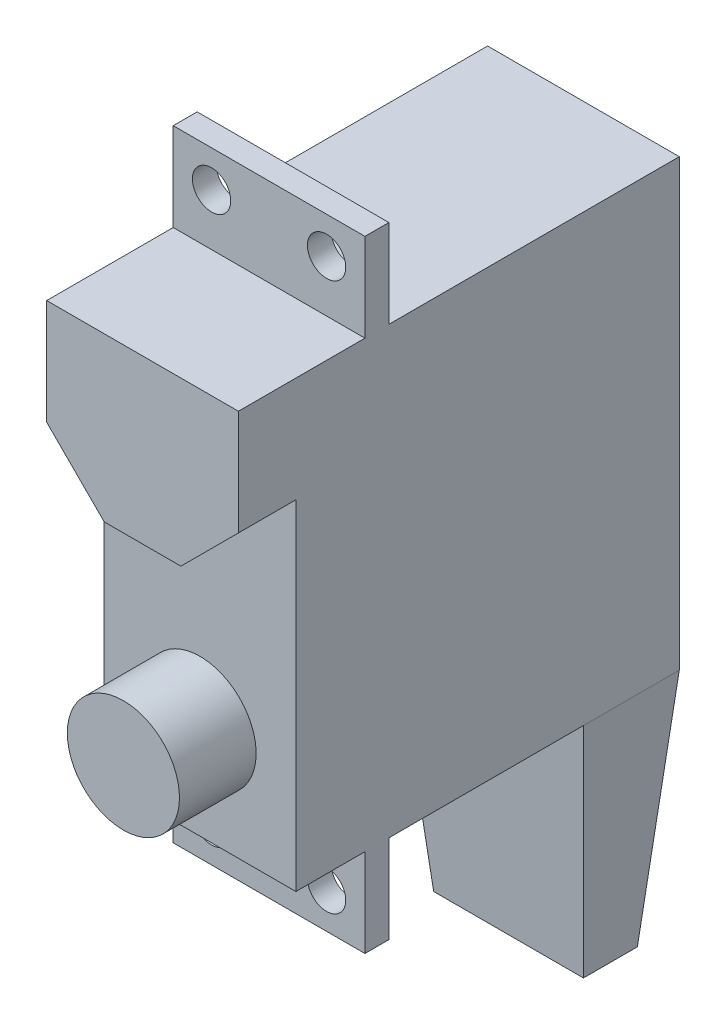
ISO-10303-21;
HEADER;
FILE_DESCRIPTION(('STEP AP214'),'2;1');
FILE_NAME('part.step','',(''),(''),'','','');
FILE_SCHEMA(('AUTOMOTIVE_DESIGN { 1 0 10303 214 1 1 1 1 }'));
ENDSEC;
DATA;
#1=APPLICATION_CONTEXT('core data for automotive mechanical design processes');
#2=APPLICATION_PROTOCOL_DEFINITION('international standard','automotive_design',2000,#1);
#3=PRODUCT_CONTEXT('',#1,'mechanical');
#4=PRODUCT('Part','Part','',(#3));
#5=PRODUCT_RELATED_PRODUCT_CATEGORY('part','',(#4));
#6=PRODUCT_DEFINITION_FORMATION('','',#4);
#7=PRODUCT_DEFINITION_CONTEXT('part definition',#1,'design');
#8=PRODUCT_DEFINITION('design','',#6,#7);
#9=PRODUCT_DEFINITION_SHAPE('','',#8);
#10=(LENGTH_UNIT() NAMED_UNIT(*) SI_UNIT(.MILLI.,.METRE.));
#11=(NAMED_UNIT(*) PLANE_ANGLE_UNIT() SI_UNIT($,.RADIAN.));
#12=(NAMED_UNIT(*) SI_UNIT($,.STERADIAN.) SOLID_ANGLE_UNIT());
#13=UNCERTAINTY_MEASURE_WITH_UNIT(LENGTH_MEASURE(1.E-05),#10,'distance_accuracy_value','');
#14=(GEOMETRIC_REPRESENTATION_CONTEXT(3) GLOBAL_UNCERTAINTY_ASSIGNED_CONTEXT((#13)) GLOBAL_UNIT_ASSIGNED_CONTEXT((#10,
#11,#12)) REPRESENTATION_CONTEXT('',''));
#15=CARTESIAN_POINT('',(0.,0.,0.));
#16=DIRECTION('',(0.,0.,1.));
#17=DIRECTION('',(1.,0.,0.));
#18=AXIS2_PLACEMENT_3D('',#15,#16,#17);
#19=CARTESIAN_POINT('',(0.,0.,20.));
#20=DIRECTION('',(0.,1.,0.));
#21=DIRECTION('',(0.,0.,1.));
#22=AXIS2_PLACEMENT_3D('',#19,#20,#21);
#23=PLANE('',#22);
#24=DIRECTION('',(-1.,0.,0.));
#25=VECTOR('',#24,1.);
#26=CARTESIAN_POINT('',(0.,0.,5.));
#27=LINE('',#26,#25);
#28=CARTESIAN_POINT('',(0.,0.,5.));
#29=VERTEX_POINT('',#28);
#30=CARTESIAN_POINT('',(-10.,0.,5.));
#31=VERTEX_POINT('',#30);
#32=EDGE_CURVE('E62',#29,#31,#27,.T.);
#33=ORIENTED_EDGE('',*,*,#32,.F.);
#34=DIRECTION('',(0.,0.,-1.));
#35=VECTOR('',#34,1.);
#36=CARTESIAN_POINT('',(0.,0.,20.));
#37=LINE('',#36,#35);
#38=CARTESIAN_POINT('',(0.,0.,15.15));
#39=VERTEX_POINT('',#38);
#40=EDGE_CURVE('E197',#39,#29,#37,.T.);
#41=ORIENTED_EDGE('',*,*,#40,.F.);
#42=DIRECTION('',(1.,0.,0.));
#43=VECTOR('',#42,1.);
#44=CARTESIAN_POINT('',(0.,0.,15.15));
#45=LINE('',#44,#43);
#46=CARTESIAN_POINT('',(-10.,0.,15.15));
#47=VERTEX_POINT('',#46);
#48=EDGE_CURVE('E300',#47,#39,#45,.T.);
#49=ORIENTED_EDGE('',*,*,#48,.F.);
#50=DIRECTION('',(0.,0.,-1.));
#51=VECTOR('',#50,1.);
#52=CARTESIAN_POINT('',(-10.,0.,20.));
#53=LINE('',#52,#51);
#54=EDGE_CURVE('E325',#47,#31,#53,.T.);
#55=ORIENTED_EDGE('',*,*,#54,.T.);
#56=EDGE_LOOP('',(#33,#41,#49,#55));
#57=FACE_BOUND('',#56,.T.);
#58=ADVANCED_FACE('F46',(#57),#23,.F.);
#59=CARTESIAN_POINT('',(0.,23.2,20.));
#60=DIRECTION('',(0.,-1.,0.));
#61=DIRECTION('',(0.,0.,-1.));
#62=AXIS2_PLACEMENT_3D('',#59,#60,#61);
#63=PLANE('',#62);
#64=DIRECTION('',(-1.,0.,0.));
#65=VECTOR('',#64,1.);
#66=CARTESIAN_POINT('',(0.,23.2,15.15));
#67=LINE('',#66,#65);
#68=CARTESIAN_POINT('',(0.,23.2,15.15));
#69=VERTEX_POINT('',#68);
#70=CARTESIAN_POINT('',(-10.,23.2,15.15));
#71=VERTEX_POINT('',#70);
#72=EDGE_CURVE('E298',#69,#71,#67,.T.);
#73=ORIENTED_EDGE('',*,*,#72,.F.);
#74=DIRECTION('',(0.,0.,-1.));
#75=VECTOR('',#74,1.);
#76=CARTESIAN_POINT('',(0.,23.2,20.));
#77=LINE('',#76,#75);
#78=CARTESIAN_POINT('',(0.,23.2,0.));
#79=VERTEX_POINT('',#78);
#80=EDGE_CURVE('E336',#69,#79,#77,.T.);
#81=ORIENTED_EDGE('',*,*,#80,.T.);
#82=DIRECTION('',(-1.,0.,0.));
#83=VECTOR('',#82,1.);
#84=CARTESIAN_POINT('',(0.,23.2,0.));
#85=LINE('',#84,#83);
#86=CARTESIAN_POINT('',(-10.,23.2,0.));
#87=VERTEX_POINT('',#86);
#88=EDGE_CURVE('E188',#79,#87,#85,.T.);
#89=ORIENTED_EDGE('',*,*,#88,.T.);
#90=DIRECTION('',(0.,0.,-1.));
#91=VECTOR('',#90,1.);
#92=CARTESIAN_POINT('',(-10.,23.2,20.));
#93=LINE('',#92,#91);
#94=EDGE_CURVE('E332',#71,#87,#93,.T.);
#95=ORIENTED_EDGE('',*,*,#94,.F.);
#96=EDGE_LOOP('',(#73,#81,#89,#95));
#97=FACE_BOUND('',#96,.T.);
#98=ADVANCED_FACE('F420',(#97),#63,.F.);
#99=CARTESIAN_POINT('',(0.,0.,20.));
#100=DIRECTION('',(0.,0.,-1.));
#101=DIRECTION('',(-1.,0.,0.));
#102=AXIS2_PLACEMENT_3D('',#99,#100,#101);
#103=PLANE('',#102);
#104=CARTESIAN_POINT('',(-5.,5.2,20.));
#105=DIRECTION('',(0.,0.,-1.));
#106=DIRECTION('',(-1.,0.,0.));
#107=AXIS2_PLACEMENT_3D('',#104,#105,#106);
#108=CIRCLE('',#107,2.925);
#109=CARTESIAN_POINT('',(-7.925,5.2,20.));
#110=VERTEX_POINT('',#109);
#111=EDGE_CURVE('E11',#110,#110,#108,.F.);
#112=ORIENTED_EDGE('',*,*,#111,.F.);
#113=EDGE_LOOP('',(#112));
#114=FACE_BOUND('',#113,.T.);
#115=DIRECTION('',(1.,0.,0.));
#116=VECTOR('',#115,1.);
#117=CARTESIAN_POINT('',(-10.,14.7,20.));
#118=LINE('',#117,#116);
#119=CARTESIAN_POINT('',(-7.,14.7,20.));
#120=VERTEX_POINT('',#119);
#121=CARTESIAN_POINT('',(-3.00000000000001,14.7,20.));
#122=VERTEX_POINT('',#121);
#123=EDGE_CURVE('E305',#120,#122,#118,.T.);
#124=ORIENTED_EDGE('',*,*,#123,.F.);
#125=DIRECTION('',(0.707106781186546,-0.707106781186549,0.));
#126=VECTOR('',#125,1.);
#127=CARTESIAN_POINT('',(3.84999999999999,3.84999999999998,20.));
#128=LINE('',#127,#126);
#129=CARTESIAN_POINT('',(-10.,17.7,20.));
#130=VERTEX_POINT('',#129);
#131=EDGE_CURVE('E356',#120,#130,#128,.F.);
#132=ORIENTED_EDGE('',*,*,#131,.T.);
#133=DIRECTION('',(0.,-1.,0.));
#134=VECTOR('',#133,1.);
#135=CARTESIAN_POINT('',(-10.,0.,20.));
#136=LINE('',#135,#134);
#137=CARTESIAN_POINT('',(-10.,0.,20.));
#138=VERTEX_POINT('',#137);
#139=EDGE_CURVE('E324',#130,#138,#136,.T.);
#140=ORIENTED_EDGE('',*,*,#139,.T.);
#141=DIRECTION('',(1.,0.,0.));
#142=VECTOR('',#141,1.);
#143=CARTESIAN_POINT('',(0.,0.,20.));
#144=LINE('',#143,#142);
#145=CARTESIAN_POINT('',(0.,0.,20.));
#146=VERTEX_POINT('',#145);
#147=EDGE_CURVE('E318',#138,#146,#144,.T.);
#148=ORIENTED_EDGE('',*,*,#147,.T.);
#149=DIRECTION('',(0.,1.,0.));
#150=VECTOR('',#149,1.);
#151=CARTESIAN_POINT('',(0.,0.,20.));
#152=LINE('',#151,#150);
#153=CARTESIAN_POINT('',(0.,17.7,20.));
#154=VERTEX_POINT('',#153);
#155=EDGE_CURVE('E321',#146,#154,#152,.T.);
#156=ORIENTED_EDGE('',*,*,#155,.T.);
#157=DIRECTION('',(0.707106781186548,0.707106781186547,0.));
#158=VECTOR('',#157,1.);
#159=CARTESIAN_POINT('',(-8.85,8.85000000000002,20.));
#160=LINE('',#159,#158);
#161=EDGE_CURVE('E55',#154,#122,#160,.F.);
#162=ORIENTED_EDGE('',*,*,#161,.T.);
#163=EDGE_LOOP('',(#124,#132,#140,#148,#156,#162));
#164=FACE_BOUND('',#163,.T.);
#165=ADVANCED_FACE('F361',(#114,#164),#103,.F.);
#166=CARTESIAN_POINT('',(-10.,0.,16.4));
#167=VERTEX_POINT('',#166);
#168=EDGE_CURVE('E329',#138,#167,#53,.T.);
#169=ORIENTED_EDGE('',*,*,#168,.T.);
#170=DIRECTION('',(1.,0.,0.));
#171=VECTOR('',#170,1.);
#172=CARTESIAN_POINT('',(0.,0.,16.4));
#173=LINE('',#172,#171);
#174=CARTESIAN_POINT('',(0.,0.,16.4));
#175=VERTEX_POINT('',#174);
#176=EDGE_CURVE('E295',#167,#175,#173,.T.);
#177=ORIENTED_EDGE('',*,*,#176,.T.);
#178=EDGE_CURVE('E340',#146,#175,#37,.T.);
#179=ORIENTED_EDGE('',*,*,#178,.F.);
#180=ORIENTED_EDGE('',*,*,#147,.F.);
#181=EDGE_LOOP('',(#169,#177,#179,#180));
#182=FACE_BOUND('',#181,.T.);
#183=ADVANCED_FACE('F390',(#182),#23,.F.);
#184=CARTESIAN_POINT('',(0.,0.,20.));
#185=DIRECTION('',(-1.,0.,0.));
#186=DIRECTION('',(0.,0.,1.));
#187=AXIS2_PLACEMENT_3D('',#184,#185,#186);
#188=PLANE('',#187);
#189=ORIENTED_EDGE('',*,*,#178,.T.);
#190=DIRECTION('',(0.,1.,0.));
#191=VECTOR('',#190,1.);
#192=CARTESIAN_POINT('',(0.,27.8,16.4));
#193=LINE('',#192,#191);
#194=CARTESIAN_POINT('',(0.,-4.6,16.4));
#195=VERTEX_POINT('',#194);
#196=EDGE_CURVE('E278',#195,#175,#193,.T.);
#197=ORIENTED_EDGE('',*,*,#196,.F.);
#198=DIRECTION('',(0.,0.,1.));
#199=VECTOR('',#198,1.);
#200=CARTESIAN_POINT('',(0.,-4.6,15.15));
#201=LINE('',#200,#199);
#202=CARTESIAN_POINT('',(0.,-4.6,15.15));
#203=VERTEX_POINT('',#202);
#204=EDGE_CURVE('E289',#203,#195,#201,.T.);
#205=ORIENTED_EDGE('',*,*,#204,.F.);
#206=DIRECTION('',(0.,1.,0.));
#207=VECTOR('',#206,1.);
#208=CARTESIAN_POINT('',(0.,27.8,15.15));
#209=LINE('',#208,#207);
#210=EDGE_CURVE('E266',#203,#39,#209,.T.);
#211=ORIENTED_EDGE('',*,*,#210,.T.);
#212=ORIENTED_EDGE('',*,*,#40,.T.);
#213=DIRECTION('',(0.,0.,1.));
#214=VECTOR('',#213,1.);
#215=CARTESIAN_POINT('',(0.,0.,0.));
#216=LINE('',#215,#214);
#217=CARTESIAN_POINT('',(0.,0.,0.));
#218=VERTEX_POINT('',#217);
#219=EDGE_CURVE('E193',#218,#29,#216,.T.);
#220=ORIENTED_EDGE('',*,*,#219,.F.);
#221=DIRECTION('',(0.,1.,0.));
#222=VECTOR('',#221,1.);
#223=CARTESIAN_POINT('',(0.,0.,0.));
#224=LINE('',#223,#222);
#225=EDGE_CURVE('E181',#218,#79,#224,.T.);
#226=ORIENTED_EDGE('',*,*,#225,.T.);
#227=ORIENTED_EDGE('',*,*,#80,.F.);
#228=CARTESIAN_POINT('',(0.,27.8,15.15));
#229=VERTEX_POINT('',#228);
#230=EDGE_CURVE('E265',#69,#229,#209,.T.);
#231=ORIENTED_EDGE('',*,*,#230,.T.);
#232=DIRECTION('',(0.,0.,1.));
#233=VECTOR('',#232,1.);
#234=CARTESIAN_POINT('',(0.,27.8,15.15));
#235=LINE('',#234,#233);
#236=CARTESIAN_POINT('',(0.,27.8,16.4));
#237=VERTEX_POINT('',#236);
#238=EDGE_CURVE('E286',#229,#237,#235,.T.);
#239=ORIENTED_EDGE('',*,*,#238,.T.);
#240=CARTESIAN_POINT('',(0.,23.2,16.4));
#241=VERTEX_POINT('',#240);
#242=EDGE_CURVE('E277',#241,#237,#193,.T.);
#243=ORIENTED_EDGE('',*,*,#242,.F.);
#244=CARTESIAN_POINT('',(0.,23.2,23.));
#245=VERTEX_POINT('',#244);
#246=EDGE_CURVE('E337',#245,#241,#77,.T.);
#247=ORIENTED_EDGE('',*,*,#246,.F.);
#248=DIRECTION('',(0.,1.,0.));
#249=VECTOR('',#248,1.);
#250=CARTESIAN_POINT('',(0.,23.2,23.));
#251=LINE('',#250,#249);
#252=CARTESIAN_POINT('',(0.,17.7,23.));
#253=VERTEX_POINT('',#252);
#254=EDGE_CURVE('E312',#253,#245,#251,.T.);
#255=ORIENTED_EDGE('',*,*,#254,.F.);
#256=DIRECTION('',(0.,0.,-1.));
#257=VECTOR('',#256,1.);
#258=CARTESIAN_POINT('',(0.,17.7,20.));
#259=LINE('',#258,#257);
#260=EDGE_CURVE('E353',#253,#154,#259,.T.);
#261=ORIENTED_EDGE('',*,*,#260,.T.);
#262=ORIENTED_EDGE('',*,*,#155,.F.);
#263=EDGE_LOOP('',(#189,#197,#205,#211,#212,#220,#226,#227,#231,#239,#243,#247,#255,#261,#262));
#264=FACE_BOUND('',#263,.T.);
#265=ADVANCED_FACE('F195',(#264),#188,.F.);
#266=ORIENTED_EDGE('',*,*,#246,.T.);
#267=DIRECTION('',(-1.,0.,0.));
#268=VECTOR('',#267,1.);
#269=CARTESIAN_POINT('',(0.,23.2,16.4));
#270=LINE('',#269,#268);
#271=CARTESIAN_POINT('',(-10.,23.2,16.4));
#272=VERTEX_POINT('',#271);
#273=EDGE_CURVE('E285',#241,#272,#270,.T.);
#274=ORIENTED_EDGE('',*,*,#273,.T.);
#275=CARTESIAN_POINT('',(-10.,23.2,23.));
#276=VERTEX_POINT('',#275);
#277=EDGE_CURVE('E333',#276,#272,#93,.T.);
#278=ORIENTED_EDGE('',*,*,#277,.F.);
#279=DIRECTION('',(-1.,0.,0.));
#280=VECTOR('',#279,1.);
#281=CARTESIAN_POINT('',(-10.,23.2,23.));
#282=LINE('',#281,#280);
#283=EDGE_CURVE('E212',#245,#276,#282,.T.);
#284=ORIENTED_EDGE('',*,*,#283,.F.);
#285=EDGE_LOOP('',(#266,#274,#278,#284));
#286=FACE_BOUND('',#285,.T.);
#287=ADVANCED_FACE('F377',(#286),#63,.F.);
#288=CARTESIAN_POINT('',(-10.,0.,20.));
#289=DIRECTION('',(1.,0.,0.));
#290=DIRECTION('',(0.,0.,-1.));
#291=AXIS2_PLACEMENT_3D('',#288,#289,#290);
#292=PLANE('',#291);
#293=ORIENTED_EDGE('',*,*,#277,.T.);
#294=DIRECTION('',(0.,-1.,0.));
#295=VECTOR('',#294,1.);
#296=CARTESIAN_POINT('',(-10.,27.8,16.4));
#297=LINE('',#296,#295);
#298=CARTESIAN_POINT('',(-10.,27.8,16.4));
#299=VERTEX_POINT('',#298);
#300=EDGE_CURVE('E272',#299,#272,#297,.T.);
#301=ORIENTED_EDGE('',*,*,#300,.F.);
#302=DIRECTION('',(0.,0.,1.));
#303=VECTOR('',#302,1.);
#304=CARTESIAN_POINT('',(-10.,27.8,15.15));
#305=LINE('',#304,#303);
#306=CARTESIAN_POINT('',(-10.,27.8,15.15));
#307=VERTEX_POINT('',#306);
#308=EDGE_CURVE('E283',#307,#299,#305,.T.);
#309=ORIENTED_EDGE('',*,*,#308,.F.);
#310=DIRECTION('',(0.,-1.,0.));
#311=VECTOR('',#310,1.);
#312=CARTESIAN_POINT('',(-10.,27.8,15.15));
#313=LINE('',#312,#311);
#314=EDGE_CURVE('E258',#307,#71,#313,.T.);
#315=ORIENTED_EDGE('',*,*,#314,.T.);
#316=ORIENTED_EDGE('',*,*,#94,.T.);
#317=DIRECTION('',(0.,-1.,0.));
#318=VECTOR('',#317,1.);
#319=CARTESIAN_POINT('',(-10.,0.,0.));
#320=LINE('',#319,#318);
#321=CARTESIAN_POINT('',(-10.,0.,0.));
#322=VERTEX_POINT('',#321);
#323=EDGE_CURVE('E322',#87,#322,#320,.T.);
#324=ORIENTED_EDGE('',*,*,#323,.T.);
#325=DIRECTION('',(0.,0.,-1.));
#326=VECTOR('',#325,1.);
#327=CARTESIAN_POINT('',(-10.,0.,0.));
#328=LINE('',#327,#326);
#329=EDGE_CURVE('E70',#31,#322,#328,.T.);
#330=ORIENTED_EDGE('',*,*,#329,.F.);
#331=ORIENTED_EDGE('',*,*,#54,.F.);
#332=CARTESIAN_POINT('',(-10.,-4.6,15.15));
#333=VERTEX_POINT('',#332);
#334=EDGE_CURVE('E262',#47,#333,#313,.T.);
#335=ORIENTED_EDGE('',*,*,#334,.T.);
#336=DIRECTION('',(0.,0.,1.));
#337=VECTOR('',#336,1.);
#338=CARTESIAN_POINT('',(-10.,-4.6,15.15));
#339=LINE('',#338,#337);
#340=CARTESIAN_POINT('',(-10.,-4.6,16.4));
#341=VERTEX_POINT('',#340);
#342=EDGE_CURVE('E271',#333,#341,#339,.T.);
#343=ORIENTED_EDGE('',*,*,#342,.T.);
#344=EDGE_CURVE('E255',#167,#341,#297,.T.);
#345=ORIENTED_EDGE('',*,*,#344,.F.);
#346=ORIENTED_EDGE('',*,*,#168,.F.);
#347=ORIENTED_EDGE('',*,*,#139,.F.);
#348=DIRECTION('',(0.,0.,1.));
#349=VECTOR('',#348,1.);
#350=CARTESIAN_POINT('',(-10.,17.7,20.));
#351=LINE('',#350,#349);
#352=CARTESIAN_POINT('',(-10.,17.7,23.));
#353=VERTEX_POINT('',#352);
#354=EDGE_CURVE('E347',#130,#353,#351,.T.);
#355=ORIENTED_EDGE('',*,*,#354,.T.);
#356=DIRECTION('',(0.,-1.,0.));
#357=VECTOR('',#356,1.);
#358=CARTESIAN_POINT('',(-10.,23.2,23.));
#359=LINE('',#358,#357);
#360=EDGE_CURVE('E306',#276,#353,#359,.T.);
#361=ORIENTED_EDGE('',*,*,#360,.F.);
#362=EDGE_LOOP('',(#293,#301,#309,#315,#316,#324,#330,#331,#335,#343,#345,#346,#347,#355,#361));
#363=FACE_BOUND('',#362,.T.);
#364=ADVANCED_FACE('F380',(#363),#292,.F.);
#365=CARTESIAN_POINT('',(0.,0.,0.));
#366=DIRECTION('',(0.,0.,-1.));
#367=DIRECTION('',(-1.,0.,0.));
#368=AXIS2_PLACEMENT_3D('',#365,#366,#367);
#369=PLANE('',#368);
#370=DIRECTION('',(1.,0.,0.));
#371=VECTOR('',#370,1.);
#372=CARTESIAN_POINT('',(0.,0.,0.));
#373=LINE('',#372,#371);
#374=EDGE_CURVE('E186',#322,#218,#373,.T.);
#375=ORIENTED_EDGE('',*,*,#374,.F.);
#376=ORIENTED_EDGE('',*,*,#323,.F.);
#377=ORIENTED_EDGE('',*,*,#88,.F.);
#378=ORIENTED_EDGE('',*,*,#225,.F.);
#379=EDGE_LOOP('',(#375,#376,#377,#378));
#380=FACE_BOUND('',#379,.T.);
#381=ADVANCED_FACE('F183',(#380),#369,.T.);
#382=CARTESIAN_POINT('',(-10.,14.7,23.));
#383=DIRECTION('',(0.,1.,0.));
#384=DIRECTION('',(0.,0.,1.));
#385=AXIS2_PLACEMENT_3D('',#382,#383,#384);
#386=PLANE('',#385);
#387=DIRECTION('',(1.,0.,0.));
#388=VECTOR('',#387,1.);
#389=CARTESIAN_POINT('',(-10.,14.7,23.));
#390=LINE('',#389,#388);
#391=CARTESIAN_POINT('',(-7.,14.7,23.));
#392=VERTEX_POINT('',#391);
#393=CARTESIAN_POINT('',(-3.00000000000001,14.7,23.));
#394=VERTEX_POINT('',#393);
#395=EDGE_CURVE('E309',#392,#394,#390,.T.);
#396=ORIENTED_EDGE('',*,*,#395,.F.);
#397=DIRECTION('',(0.,0.,-1.));
#398=VECTOR('',#397,1.);
#399=CARTESIAN_POINT('',(-7.,14.7,23.));
#400=LINE('',#399,#398);
#401=EDGE_CURVE('E344',#392,#120,#400,.T.);
#402=ORIENTED_EDGE('',*,*,#401,.T.);
#403=ORIENTED_EDGE('',*,*,#123,.T.);
#404=DIRECTION('',(0.,0.,1.));
#405=VECTOR('',#404,1.);
#406=CARTESIAN_POINT('',(-3.00000000000001,14.7,23.));
#407=LINE('',#406,#405);
#408=EDGE_CURVE('E342',#122,#394,#407,.T.);
#409=ORIENTED_EDGE('',*,*,#408,.T.);
#410=EDGE_LOOP('',(#396,#402,#403,#409));
#411=FACE_BOUND('',#410,.T.);
#412=ADVANCED_FACE('F367',(#411),#386,.F.);
#413=CARTESIAN_POINT('',(0.,0.,23.));
#414=DIRECTION('',(0.,0.,1.));
#415=DIRECTION('',(1.,0.,0.));
#416=AXIS2_PLACEMENT_3D('',#413,#414,#415);
#417=PLANE('',#416);
#418=ORIENTED_EDGE('',*,*,#360,.T.);
#419=DIRECTION('',(-0.707106781186546,0.707106781186549,0.));
#420=VECTOR('',#419,1.);
#421=CARTESIAN_POINT('',(3.84999999999999,3.84999999999998,23.));
#422=LINE('',#421,#420);
#423=EDGE_CURVE('E351',#353,#392,#422,.F.);
#424=ORIENTED_EDGE('',*,*,#423,.T.);
#425=ORIENTED_EDGE('',*,*,#395,.T.);
#426=DIRECTION('',(-0.707106781186548,-0.707106781186547,0.));
#427=VECTOR('',#426,1.);
#428=CARTESIAN_POINT('',(-8.85,8.85000000000002,23.));
#429=LINE('',#428,#427);
#430=EDGE_CURVE('E349',#394,#253,#429,.F.);
#431=ORIENTED_EDGE('',*,*,#430,.T.);
#432=ORIENTED_EDGE('',*,*,#254,.T.);
#433=ORIENTED_EDGE('',*,*,#283,.T.);
#434=EDGE_LOOP('',(#418,#424,#425,#431,#432,#433));
#435=FACE_BOUND('',#434,.T.);
#436=ADVANCED_FACE('F372',(#435),#417,.T.);
#437=CARTESIAN_POINT('',(-7.,14.7,23.));
#438=DIRECTION('',(0.707106781186549,0.707106781186546,0.));
#439=DIRECTION('',(0.,0.,-1.));
#440=AXIS2_PLACEMENT_3D('',#437,#438,#439);
#441=PLANE('',#440);
#442=ORIENTED_EDGE('',*,*,#423,.F.);
#443=ORIENTED_EDGE('',*,*,#354,.F.);
#444=ORIENTED_EDGE('',*,*,#131,.F.);
#445=ORIENTED_EDGE('',*,*,#401,.F.);
#446=EDGE_LOOP('',(#442,#443,#444,#445));
#447=FACE_BOUND('',#446,.T.);
#448=ADVANCED_FACE('F385',(#447),#441,.F.);
#449=CARTESIAN_POINT('',(0.,17.7,20.));
#450=DIRECTION('',(-0.707106781186547,0.707106781186548,0.));
#451=DIRECTION('',(0.,0.,-1.));
#452=AXIS2_PLACEMENT_3D('',#449,#450,#451);
#453=PLANE('',#452);
#454=ORIENTED_EDGE('',*,*,#430,.F.);
#455=ORIENTED_EDGE('',*,*,#408,.F.);
#456=ORIENTED_EDGE('',*,*,#161,.F.);
#457=ORIENTED_EDGE('',*,*,#260,.F.);
#458=EDGE_LOOP('',(#454,#455,#456,#457));
#459=FACE_BOUND('',#458,.T.);
#460=ADVANCED_FACE('F49',(#459),#453,.F.);
#461=CARTESIAN_POINT('',(-5.,5.2,24.));
#462=DIRECTION('',(0.,0.,-1.));
#463=DIRECTION('',(-1.,0.,0.));
#464=AXIS2_PLACEMENT_3D('',#461,#462,#463);
#465=CYLINDRICAL_SURFACE('',#464,2.925);
#466=CARTESIAN_POINT('',(-5.,5.2,24.));
#467=DIRECTION('',(0.,0.,1.));
#468=DIRECTION('',(1.,0.,0.));
#469=AXIS2_PLACEMENT_3D('',#466,#467,#468);
#470=CIRCLE('',#469,2.925);
#471=CARTESIAN_POINT('',(-2.075,5.2,24.));
#472=VERTEX_POINT('',#471);
#473=EDGE_CURVE('E302',#472,#472,#470,.T.);
#474=ORIENTED_EDGE('',*,*,#473,.F.);
#475=EDGE_LOOP('',(#474));
#476=FACE_BOUND('',#475,.T.);
#477=ORIENTED_EDGE('',*,*,#111,.T.);
#478=EDGE_LOOP('',(#477));
#479=FACE_BOUND('',#478,.T.);
#480=ADVANCED_FACE('F581',(#476,#479),#465,.T.);
#481=CARTESIAN_POINT('',(-5.,5.2,24.));
#482=DIRECTION('',(0.,0.,1.));
#483=DIRECTION('',(1.,0.,0.));
#484=AXIS2_PLACEMENT_3D('',#481,#482,#483);
#485=PLANE('',#484);
#486=ORIENTED_EDGE('',*,*,#473,.T.);
#487=EDGE_LOOP('',(#486));
#488=FACE_BOUND('',#487,.T.);
#489=ADVANCED_FACE('F461',(#488),#485,.T.);
#490=CARTESIAN_POINT('',(-10.,27.8,15.15));
#491=DIRECTION('',(0.,1.,0.));
#492=DIRECTION('',(-1.,0.,0.));
#493=AXIS2_PLACEMENT_3D('',#490,#491,#492);
#494=PLANE('',#493);
#495=DIRECTION('',(-1.,0.,0.));
#496=VECTOR('',#495,1.);
#497=CARTESIAN_POINT('',(-10.,27.8,16.4));
#498=LINE('',#497,#496);
#499=EDGE_CURVE('E280',#237,#299,#498,.T.);
#500=ORIENTED_EDGE('',*,*,#499,.F.);
#501=ORIENTED_EDGE('',*,*,#238,.F.);
#502=DIRECTION('',(-1.,0.,0.));
#503=VECTOR('',#502,1.);
#504=CARTESIAN_POINT('',(-10.,27.8,15.15));
#505=LINE('',#504,#503);
#506=EDGE_CURVE('E268',#229,#307,#505,.T.);
#507=ORIENTED_EDGE('',*,*,#506,.T.);
#508=ORIENTED_EDGE('',*,*,#308,.T.);
#509=EDGE_LOOP('',(#500,#501,#507,#508));
#510=FACE_BOUND('',#509,.T.);
#511=ADVANCED_FACE('F456',(#510),#494,.T.);
#512=CARTESIAN_POINT('',(0.,0.,16.4));
#513=DIRECTION('',(0.,0.,1.));
#514=DIRECTION('',(1.,0.,0.));
#515=AXIS2_PLACEMENT_3D('',#512,#513,#514);
#516=PLANE('',#515);
#517=CARTESIAN_POINT('',(-8.,25.9,16.4));
#518=DIRECTION('',(0.,0.,1.));
#519=DIRECTION('',(1.,0.,0.));
#520=AXIS2_PLACEMENT_3D('',#517,#518,#519);
#521=CIRCLE('',#520,1.);
#522=CARTESIAN_POINT('',(-7.,25.9,16.4));
#523=VERTEX_POINT('',#522);
#524=EDGE_CURVE('E246',#523,#523,#521,.T.);
#525=ORIENTED_EDGE('',*,*,#524,.F.);
#526=EDGE_LOOP('',(#525));
#527=FACE_BOUND('',#526,.T.);
#528=CARTESIAN_POINT('',(-2.,25.9,16.4));
#529=DIRECTION('',(0.,0.,1.));
#530=DIRECTION('',(1.,0.,0.));
#531=AXIS2_PLACEMENT_3D('',#528,#529,#530);
#532=CIRCLE('',#531,1.);
#533=CARTESIAN_POINT('',(-0.999999999999996,25.9,16.4));
#534=VERTEX_POINT('',#533);
#535=EDGE_CURVE('E240',#534,#534,#532,.T.);
#536=ORIENTED_EDGE('',*,*,#535,.F.);
#537=EDGE_LOOP('',(#536));
#538=FACE_BOUND('',#537,.T.);
#539=ORIENTED_EDGE('',*,*,#273,.F.);
#540=ORIENTED_EDGE('',*,*,#242,.T.);
#541=ORIENTED_EDGE('',*,*,#499,.T.);
#542=ORIENTED_EDGE('',*,*,#300,.T.);
#543=EDGE_LOOP('',(#539,#540,#541,#542));
#544=FACE_BOUND('',#543,.T.);
#545=ADVANCED_FACE('F460',(#527,#538,#544),#516,.T.);
#546=CARTESIAN_POINT('',(0.,0.,15.15));
#547=DIRECTION('',(0.,0.,1.));
#548=DIRECTION('',(1.,0.,0.));
#549=AXIS2_PLACEMENT_3D('',#546,#547,#548);
#550=PLANE('',#549);
#551=CARTESIAN_POINT('',(-8.,25.9,15.15));
#552=DIRECTION('',(0.,0.,1.));
#553=DIRECTION('',(1.,0.,0.));
#554=AXIS2_PLACEMENT_3D('',#551,#552,#553);
#555=CIRCLE('',#554,1.);
#556=CARTESIAN_POINT('',(-7.,25.9,15.15));
#557=VERTEX_POINT('',#556);
#558=EDGE_CURVE('E249',#557,#557,#555,.T.);
#559=ORIENTED_EDGE('',*,*,#558,.T.);
#560=EDGE_LOOP('',(#559));
#561=FACE_BOUND('',#560,.T.);
#562=CARTESIAN_POINT('',(-2.,25.9,15.15));
#563=DIRECTION('',(0.,0.,1.));
#564=DIRECTION('',(1.,0.,0.));
#565=AXIS2_PLACEMENT_3D('',#562,#563,#564);
#566=CIRCLE('',#565,1.);
#567=CARTESIAN_POINT('',(-0.999999999999996,25.9,15.15));
#568=VERTEX_POINT('',#567);
#569=EDGE_CURVE('E243',#568,#568,#566,.T.);
#570=ORIENTED_EDGE('',*,*,#569,.T.);
#571=EDGE_LOOP('',(#570));
#572=FACE_BOUND('',#571,.T.);
#573=ORIENTED_EDGE('',*,*,#230,.F.);
#574=ORIENTED_EDGE('',*,*,#72,.T.);
#575=ORIENTED_EDGE('',*,*,#314,.F.);
#576=ORIENTED_EDGE('',*,*,#506,.F.);
#577=EDGE_LOOP('',(#573,#574,#575,#576));
#578=FACE_BOUND('',#577,.T.);
#579=ADVANCED_FACE('F481',(#561,#572,#578),#550,.F.);
#580=CARTESIAN_POINT('',(-2.,-2.7,15.15));
#581=DIRECTION('',(0.,0.,1.));
#582=DIRECTION('',(1.,0.,0.));
#583=AXIS2_PLACEMENT_3D('',#580,#581,#582);
#584=CIRCLE('',#583,1.);
#585=CARTESIAN_POINT('',(-0.999999999999996,-2.7,15.15));
#586=VERTEX_POINT('',#585);
#587=EDGE_CURVE('E237',#586,#586,#584,.T.);
#588=ORIENTED_EDGE('',*,*,#587,.T.);
#589=EDGE_LOOP('',(#588));
#590=FACE_BOUND('',#589,.T.);
#591=CARTESIAN_POINT('',(-8.,-2.7,15.15));
#592=DIRECTION('',(0.,0.,1.));
#593=DIRECTION('',(1.,0.,0.));
#594=AXIS2_PLACEMENT_3D('',#591,#592,#593);
#595=CIRCLE('',#594,1.);
#596=CARTESIAN_POINT('',(-7.,-2.7,15.15));
#597=VERTEX_POINT('',#596);
#598=EDGE_CURVE('E252',#597,#597,#595,.T.);
#599=ORIENTED_EDGE('',*,*,#598,.T.);
#600=EDGE_LOOP('',(#599));
#601=FACE_BOUND('',#600,.T.);
#602=ORIENTED_EDGE('',*,*,#334,.F.);
#603=ORIENTED_EDGE('',*,*,#48,.T.);
#604=ORIENTED_EDGE('',*,*,#210,.F.);
#605=DIRECTION('',(1.,0.,0.));
#606=VECTOR('',#605,1.);
#607=CARTESIAN_POINT('',(-10.,-4.6,15.15));
#608=LINE('',#607,#606);
#609=EDGE_CURVE('E261',#333,#203,#608,.T.);
#610=ORIENTED_EDGE('',*,*,#609,.F.);
#611=EDGE_LOOP('',(#602,#603,#604,#610));
#612=FACE_BOUND('',#611,.T.);
#613=ADVANCED_FACE('F401',(#590,#601,#612),#550,.F.);
#614=CARTESIAN_POINT('',(-2.,-2.7,16.4));
#615=DIRECTION('',(0.,0.,1.));
#616=DIRECTION('',(1.,0.,0.));
#617=AXIS2_PLACEMENT_3D('',#614,#615,#616);
#618=CIRCLE('',#617,1.);
#619=CARTESIAN_POINT('',(-0.999999999999996,-2.7,16.4));
#620=VERTEX_POINT('',#619);
#621=EDGE_CURVE('E233',#620,#620,#618,.T.);
#622=ORIENTED_EDGE('',*,*,#621,.F.);
#623=EDGE_LOOP('',(#622));
#624=FACE_BOUND('',#623,.T.);
#625=CARTESIAN_POINT('',(-8.,-2.7,16.4));
#626=DIRECTION('',(0.,0.,1.));
#627=DIRECTION('',(1.,0.,0.));
#628=AXIS2_PLACEMENT_3D('',#625,#626,#627);
#629=CIRCLE('',#628,1.);
#630=CARTESIAN_POINT('',(-7.,-2.7,16.4));
#631=VERTEX_POINT('',#630);
#632=EDGE_CURVE('E236',#631,#631,#629,.T.);
#633=ORIENTED_EDGE('',*,*,#632,.F.);
#634=EDGE_LOOP('',(#633));
#635=FACE_BOUND('',#634,.T.);
#636=ORIENTED_EDGE('',*,*,#176,.F.);
#637=ORIENTED_EDGE('',*,*,#344,.T.);
#638=DIRECTION('',(1.,0.,0.));
#639=VECTOR('',#638,1.);
#640=CARTESIAN_POINT('',(-10.,-4.6,16.4));
#641=LINE('',#640,#639);
#642=EDGE_CURVE('E274',#341,#195,#641,.T.);
#643=ORIENTED_EDGE('',*,*,#642,.T.);
#644=ORIENTED_EDGE('',*,*,#196,.T.);
#645=EDGE_LOOP('',(#636,#637,#643,#644));
#646=FACE_BOUND('',#645,.T.);
#647=ADVANCED_FACE('F395',(#624,#635,#646),#516,.T.);
#648=CARTESIAN_POINT('',(-10.,-4.6,15.15));
#649=DIRECTION('',(0.,-1.,0.));
#650=DIRECTION('',(0.,0.,-1.));
#651=AXIS2_PLACEMENT_3D('',#648,#649,#650);
#652=PLANE('',#651);
#653=ORIENTED_EDGE('',*,*,#642,.F.);
#654=ORIENTED_EDGE('',*,*,#342,.F.);
#655=ORIENTED_EDGE('',*,*,#609,.T.);
#656=ORIENTED_EDGE('',*,*,#204,.T.);
#657=EDGE_LOOP('',(#653,#654,#655,#656));
#658=FACE_BOUND('',#657,.T.);
#659=ADVANCED_FACE('F398',(#658),#652,.T.);
#660=CARTESIAN_POINT('',(-8.,-2.7,15.15));
#661=DIRECTION('',(0.,0.,1.));
#662=DIRECTION('',(1.,0.,0.));
#663=AXIS2_PLACEMENT_3D('',#660,#661,#662);
#664=CYLINDRICAL_SURFACE('',#663,1.);
#665=ORIENTED_EDGE('',*,*,#598,.F.);
#666=EDGE_LOOP('',(#665));
#667=FACE_BOUND('',#666,.T.);
#668=ORIENTED_EDGE('',*,*,#632,.T.);
#669=EDGE_LOOP('',(#668));
#670=FACE_BOUND('',#669,.T.);
#671=ADVANCED_FACE('F472',(#667,#670),#664,.F.);
#672=CARTESIAN_POINT('',(-2.,-2.7,15.15));
#673=DIRECTION('',(0.,0.,1.));
#674=DIRECTION('',(1.,0.,0.));
#675=AXIS2_PLACEMENT_3D('',#672,#673,#674);
#676=CYLINDRICAL_SURFACE('',#675,1.);
#677=ORIENTED_EDGE('',*,*,#587,.F.);
#678=EDGE_LOOP('',(#677));
#679=FACE_BOUND('',#678,.T.);
#680=ORIENTED_EDGE('',*,*,#621,.T.);
#681=EDGE_LOOP('',(#680));
#682=FACE_BOUND('',#681,.T.);
#683=ADVANCED_FACE('F510',(#679,#682),#676,.F.);
#684=CARTESIAN_POINT('',(-2.,25.9,15.15));
#685=DIRECTION('',(0.,0.,1.));
#686=DIRECTION('',(1.,0.,0.));
#687=AXIS2_PLACEMENT_3D('',#684,#685,#686);
#688=CYLINDRICAL_SURFACE('',#687,1.);
#689=ORIENTED_EDGE('',*,*,#569,.F.);
#690=EDGE_LOOP('',(#689));
#691=FACE_BOUND('',#690,.T.);
#692=ORIENTED_EDGE('',*,*,#535,.T.);
#693=EDGE_LOOP('',(#692));
#694=FACE_BOUND('',#693,.T.);
#695=ADVANCED_FACE('F519',(#691,#694),#688,.F.);
#696=CARTESIAN_POINT('',(-8.,25.9,15.15));
#697=DIRECTION('',(0.,0.,1.));
#698=DIRECTION('',(1.,0.,0.));
#699=AXIS2_PLACEMENT_3D('',#696,#697,#698);
#700=CYLINDRICAL_SURFACE('',#699,1.);
#701=ORIENTED_EDGE('',*,*,#558,.F.);
#702=EDGE_LOOP('',(#701));
#703=FACE_BOUND('',#702,.T.);
#704=ORIENTED_EDGE('',*,*,#524,.T.);
#705=EDGE_LOOP('',(#704));
#706=FACE_BOUND('',#705,.T.);
#707=ADVANCED_FACE('F527',(#703,#706),#700,.F.);
#708=CARTESIAN_POINT('',(0.,0.,0.));
#709=DIRECTION('',(0.996194698091746,-0.0871557427476584,0.));
#710=DIRECTION('',(0.0871557427476584,0.996194698091746,0.));
#711=AXIS2_PLACEMENT_3D('',#708,#709,#710);
#712=PLANE('',#711);
#713=ORIENTED_EDGE('',*,*,#219,.T.);
#714=DIRECTION('',(0.0868265938642478,0.992432509138967,0.0868265938642478));
#715=VECTOR('',#714,1.);
#716=CARTESIAN_POINT('',(0.,0.,5.));
#717=LINE('',#716,#715);
#718=CARTESIAN_POINT('',(-1.09360829407405,-12.5,3.90639170592595));
#719=VERTEX_POINT('',#718);
#720=EDGE_CURVE('E224',#719,#29,#717,.T.);
#721=ORIENTED_EDGE('',*,*,#720,.F.);
#722=DIRECTION('',(0.,0.,-1.));
#723=VECTOR('',#722,1.);
#724=CARTESIAN_POINT('',(-1.09360829407405,-12.5,0.));
#725=LINE('',#724,#723);
#726=CARTESIAN_POINT('',(-1.09360829407405,-12.5,1.09360829407405));
#727=VERTEX_POINT('',#726);
#728=EDGE_CURVE('E216',#727,#719,#725,.F.);
#729=ORIENTED_EDGE('',*,*,#728,.F.);
#730=DIRECTION('',(0.0868265938642478,0.992432509138967,-0.0868265938642478));
#731=VECTOR('',#730,1.);
#732=CARTESIAN_POINT('',(0.,0.,0.));
#733=LINE('',#732,#731);
#734=EDGE_CURVE('E208',#727,#218,#733,.T.);
#735=ORIENTED_EDGE('',*,*,#734,.T.);
#736=EDGE_LOOP('',(#713,#721,#729,#735));
#737=FACE_BOUND('',#736,.T.);
#738=ADVANCED_FACE('F214',(#737),#712,.T.);
#739=CARTESIAN_POINT('',(0.,0.,5.));
#740=DIRECTION('',(0.,-0.0871557427476584,0.996194698091746));
#741=DIRECTION('',(0.,-0.996194698091746,-0.0871557427476584));
#742=AXIS2_PLACEMENT_3D('',#739,#740,#741);
#743=PLANE('',#742);
#744=ORIENTED_EDGE('',*,*,#32,.T.);
#745=DIRECTION('',(-0.0868265938642478,0.992432509138967,0.0868265938642478));
#746=VECTOR('',#745,1.);
#747=CARTESIAN_POINT('',(-9.96230571298967,-0.430847672043427,4.96230571298966));
#748=LINE('',#747,#746);
#749=CARTESIAN_POINT('',(-8.90639170592595,-12.5,3.90639170592595));
#750=VERTEX_POINT('',#749);
#751=EDGE_CURVE('E219',#750,#31,#748,.T.);
#752=ORIENTED_EDGE('',*,*,#751,.F.);
#753=DIRECTION('',(1.,0.,0.));
#754=VECTOR('',#753,1.);
#755=CARTESIAN_POINT('',(0.,-12.5,3.90639170592595));
#756=LINE('',#755,#754);
#757=EDGE_CURVE('E230',#719,#750,#756,.F.);
#758=ORIENTED_EDGE('',*,*,#757,.F.);
#759=ORIENTED_EDGE('',*,*,#720,.T.);
#760=EDGE_LOOP('',(#744,#752,#758,#759));
#761=FACE_BOUND('',#760,.T.);
#762=ADVANCED_FACE('F405',(#761),#743,.T.);
#763=CARTESIAN_POINT('',(-10.,0.,0.));
#764=DIRECTION('',(-0.996194698091746,-0.0871557427476584,0.));
#765=DIRECTION('',(0.0871557427476584,-0.996194698091746,0.));
#766=AXIS2_PLACEMENT_3D('',#763,#764,#765);
#767=PLANE('',#766);
#768=ORIENTED_EDGE('',*,*,#329,.T.);
#769=DIRECTION('',(-0.0868265938642478,0.992432509138967,-0.0868265938642478));
#770=VECTOR('',#769,1.);
#771=CARTESIAN_POINT('',(-9.92461142597933,-0.861695344086855,0.0753885740206703));
#772=LINE('',#771,#770);
#773=CARTESIAN_POINT('',(-8.90639170592595,-12.5,1.09360829407405));
#774=VERTEX_POINT('',#773);
#775=EDGE_CURVE('E211',#774,#322,#772,.T.);
#776=ORIENTED_EDGE('',*,*,#775,.F.);
#777=DIRECTION('',(0.,0.,1.));
#778=VECTOR('',#777,1.);
#779=CARTESIAN_POINT('',(-8.90639170592595,-12.5,0.));
#780=LINE('',#779,#778);
#781=EDGE_CURVE('E221',#750,#774,#780,.F.);
#782=ORIENTED_EDGE('',*,*,#781,.F.);
#783=ORIENTED_EDGE('',*,*,#751,.T.);
#784=EDGE_LOOP('',(#768,#776,#782,#783));
#785=FACE_BOUND('',#784,.T.);
#786=ADVANCED_FACE('F409',(#785),#767,.T.);
#787=CARTESIAN_POINT('',(0.,0.,0.));
#788=DIRECTION('',(0.,-0.0871557427476584,-0.996194698091746));
#789=DIRECTION('',(0.,0.996194698091746,-0.0871557427476584));
#790=AXIS2_PLACEMENT_3D('',#787,#788,#789);
#791=PLANE('',#790);
#792=ORIENTED_EDGE('',*,*,#374,.T.);
#793=ORIENTED_EDGE('',*,*,#734,.F.);
#794=DIRECTION('',(-1.,0.,0.));
#795=VECTOR('',#794,1.);
#796=CARTESIAN_POINT('',(0.,-12.5,1.09360829407405));
#797=LINE('',#796,#795);
#798=EDGE_CURVE('E217',#774,#727,#797,.F.);
#799=ORIENTED_EDGE('',*,*,#798,.F.);
#800=ORIENTED_EDGE('',*,*,#775,.T.);
#801=EDGE_LOOP('',(#792,#793,#799,#800));
#802=FACE_BOUND('',#801,.T.);
#803=ADVANCED_FACE('F206',(#802),#791,.T.);
#804=CARTESIAN_POINT('',(0.,-12.5,0.));
#805=DIRECTION('',(0.,-1.,0.));
#806=DIRECTION('',(0.,0.,-1.));
#807=AXIS2_PLACEMENT_3D('',#804,#805,#806);
#808=PLANE('',#807);
#809=ORIENTED_EDGE('',*,*,#728,.T.);
#810=ORIENTED_EDGE('',*,*,#757,.T.);
#811=ORIENTED_EDGE('',*,*,#781,.T.);
#812=ORIENTED_EDGE('',*,*,#798,.T.);
#813=EDGE_LOOP('',(#809,#810,#811,#812));
#814=FACE_BOUND('',#813,.T.);
#815=ADVANCED_FACE('F411',(#814),#808,.T.);
#816=CLOSED_SHELL('',(#58,#98,#165,#183,#265,#287,#364,#381,#412,#436,#448,#460,#480,#489,#511,
#545,#579,#613,#647,#659,#671,#683,#695,#707,#738,#762,#786,#803,#815));
#817=MANIFOLD_SOLID_BREP('B2',#816);
#818=ADVANCED_BREP_SHAPE_REPRESENTATION('',(#18,#817),#14);
#819=SHAPE_DEFINITION_REPRESENTATION(#9,#818);
ENDSEC;
END-ISO-10303-21;
